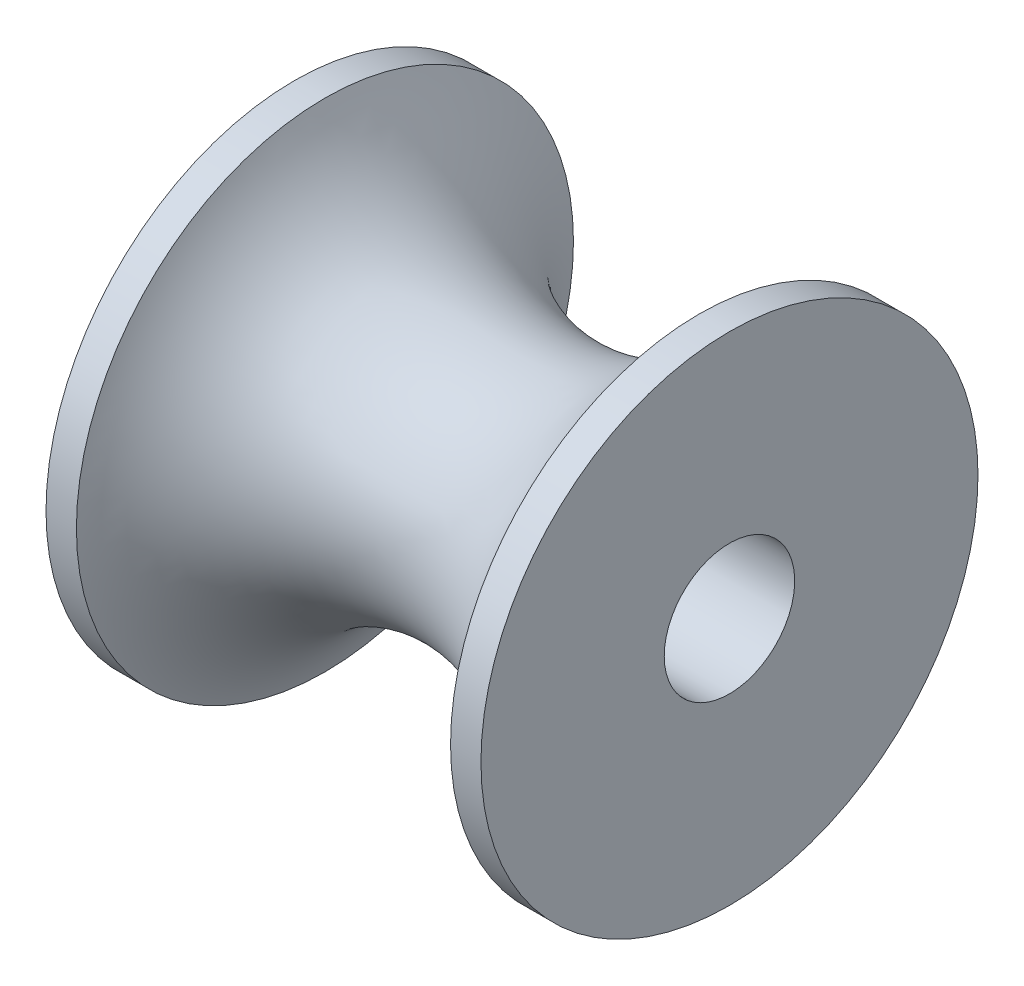
ISO-10303-21;
HEADER;
FILE_DESCRIPTION(('STEP AP214'),'2;1');
FILE_NAME('part.step','',(''),(''),'','','');
FILE_SCHEMA(('AUTOMOTIVE_DESIGN { 1 0 10303 214 1 1 1 1 }'));
ENDSEC;
DATA;
#1=APPLICATION_CONTEXT('core data for automotive mechanical design processes');
#2=APPLICATION_PROTOCOL_DEFINITION('international standard','automotive_design',2000,#1);
#3=PRODUCT_CONTEXT('',#1,'mechanical');
#4=PRODUCT('Part','Part','',(#3));
#5=PRODUCT_RELATED_PRODUCT_CATEGORY('part','',(#4));
#6=PRODUCT_DEFINITION_FORMATION('','',#4);
#7=PRODUCT_DEFINITION_CONTEXT('part definition',#1,'design');
#8=PRODUCT_DEFINITION('design','',#6,#7);
#9=PRODUCT_DEFINITION_SHAPE('','',#8);
#10=(LENGTH_UNIT() NAMED_UNIT(*) SI_UNIT(.MILLI.,.METRE.));
#11=(NAMED_UNIT(*) PLANE_ANGLE_UNIT() SI_UNIT($,.RADIAN.));
#12=(NAMED_UNIT(*) SI_UNIT($,.STERADIAN.) SOLID_ANGLE_UNIT());
#13=UNCERTAINTY_MEASURE_WITH_UNIT(LENGTH_MEASURE(1.E-05),#10,'distance_accuracy_value','');
#14=(GEOMETRIC_REPRESENTATION_CONTEXT(3) GLOBAL_UNCERTAINTY_ASSIGNED_CONTEXT((#13)) GLOBAL_UNIT_ASSIGNED_CONTEXT((#10,
#11,#12)) REPRESENTATION_CONTEXT('',''));
#15=CARTESIAN_POINT('',(0.,0.,0.));
#16=DIRECTION('',(0.,0.,1.));
#17=DIRECTION('',(1.,0.,0.));
#18=AXIS2_PLACEMENT_3D('',#15,#16,#17);
#19=CARTESIAN_POINT('',(0.,0.,0.));
#20=DIRECTION('',(1.,0.,0.));
#21=DIRECTION('',(0.,0.,-1.));
#22=AXIS2_PLACEMENT_3D('',#19,#20,#21);
#23=PLANE('',#22);
#24=CARTESIAN_POINT('',(0.,0.,0.));
#25=DIRECTION('',(-1.,0.,0.));
#26=DIRECTION('',(0.,0.,1.));
#27=AXIS2_PLACEMENT_3D('',#24,#25,#26);
#28=CIRCLE('',#27,2.1);
#29=CARTESIAN_POINT('',(0.,0.,2.1));
#30=VERTEX_POINT('',#29);
#31=EDGE_CURVE('E75',#30,#30,#28,.T.);
#32=ORIENTED_EDGE('',*,*,#31,.F.);
#33=EDGE_LOOP('',(#32));
#34=FACE_BOUND('',#33,.T.);
#35=CARTESIAN_POINT('',(0.,0.,0.));
#36=DIRECTION('',(-1.,0.,0.));
#37=DIRECTION('',(0.,0.,1.));
#38=AXIS2_PLACEMENT_3D('',#35,#36,#37);
#39=CIRCLE('',#38,8.);
#40=CARTESIAN_POINT('',(0.,0.,8.));
#41=VERTEX_POINT('',#40);
#42=EDGE_CURVE('E68',#41,#41,#39,.T.);
#43=ORIENTED_EDGE('',*,*,#42,.T.);
#44=EDGE_LOOP('',(#43));
#45=FACE_BOUND('',#44,.T.);
#46=ADVANCED_FACE('F51',(#34,#45),#23,.F.);
#47=CARTESIAN_POINT('',(14.,0.,0.));
#48=DIRECTION('',(-1.,0.,0.));
#49=DIRECTION('',(0.,0.,1.));
#50=AXIS2_PLACEMENT_3D('',#47,#48,#49);
#51=PLANE('',#50);
#52=CARTESIAN_POINT('',(14.,0.,0.));
#53=DIRECTION('',(-1.,0.,0.));
#54=DIRECTION('',(0.,0.,1.));
#55=AXIS2_PLACEMENT_3D('',#52,#53,#54);
#56=CIRCLE('',#55,2.1);
#57=CARTESIAN_POINT('',(14.,0.,2.1));
#58=VERTEX_POINT('',#57);
#59=EDGE_CURVE('E74',#58,#58,#56,.T.);
#60=ORIENTED_EDGE('',*,*,#59,.T.);
#61=EDGE_LOOP('',(#60));
#62=FACE_BOUND('',#61,.T.);
#63=CARTESIAN_POINT('',(14.,0.,0.));
#64=DIRECTION('',(-1.,0.,0.));
#65=DIRECTION('',(0.,0.,1.));
#66=AXIS2_PLACEMENT_3D('',#63,#64,#65);
#67=CIRCLE('',#66,8.);
#68=CARTESIAN_POINT('',(14.,0.,8.));
#69=VERTEX_POINT('',#68);
#70=EDGE_CURVE('E11',#69,#69,#67,.T.);
#71=ORIENTED_EDGE('',*,*,#70,.F.);
#72=EDGE_LOOP('',(#71));
#73=FACE_BOUND('',#72,.T.);
#74=ADVANCED_FACE('F83',(#62,#73),#51,.F.);
#75=CARTESIAN_POINT('',(0.,0.,0.));
#76=DIRECTION('',(-1.,0.,0.));
#77=DIRECTION('',(0.,0.,1.));
#78=AXIS2_PLACEMENT_3D('',#75,#76,#77);
#79=CYLINDRICAL_SURFACE('',#78,8.);
#80=CARTESIAN_POINT('',(13.0214330518296,0.,0.));
#81=DIRECTION('',(-1.,0.,0.));
#82=DIRECTION('',(0.,0.,1.));
#83=AXIS2_PLACEMENT_3D('',#80,#81,#82);
#84=CIRCLE('',#83,8.);
#85=CARTESIAN_POINT('',(13.0214330518296,0.,8.));
#86=VERTEX_POINT('',#85);
#87=EDGE_CURVE('E58',#86,#86,#84,.T.);
#88=ORIENTED_EDGE('',*,*,#87,.F.);
#89=EDGE_LOOP('',(#88));
#90=FACE_BOUND('',#89,.T.);
#91=ORIENTED_EDGE('',*,*,#70,.T.);
#92=EDGE_LOOP('',(#91));
#93=FACE_BOUND('',#92,.T.);
#94=ADVANCED_FACE('F104',(#90,#93),#79,.T.);
#95=CARTESIAN_POINT('',(7.,0.,0.));
#96=DIRECTION('',(-1.,0.,0.));
#97=DIRECTION('',(0.,0.,1.));
#98=AXIS2_PLACEMENT_3D('',#95,#96,#97);
#99=TOROIDAL_SURFACE('',#98,10.4479264699608,6.5);
#100=CARTESIAN_POINT('',(0.978566948170445,0.,0.));
#101=DIRECTION('',(-1.,0.,0.));
#102=DIRECTION('',(0.,0.,1.));
#103=AXIS2_PLACEMENT_3D('',#100,#101,#102);
#104=CIRCLE('',#103,8.);
#105=CARTESIAN_POINT('',(0.978566948170445,0.,8.));
#106=VERTEX_POINT('',#105);
#107=EDGE_CURVE('E63',#106,#106,#104,.T.);
#108=ORIENTED_EDGE('',*,*,#107,.F.);
#109=EDGE_LOOP('',(#108));
#110=FACE_BOUND('',#109,.T.);
#111=ORIENTED_EDGE('',*,*,#87,.T.);
#112=EDGE_LOOP('',(#111));
#113=FACE_BOUND('',#112,.T.);
#114=ADVANCED_FACE('F99',(#110,#113),#99,.F.);
#115=CARTESIAN_POINT('',(0.,0.,0.));
#116=DIRECTION('',(-1.,0.,0.));
#117=DIRECTION('',(0.,0.,1.));
#118=AXIS2_PLACEMENT_3D('',#115,#116,#117);
#119=CYLINDRICAL_SURFACE('',#118,8.);
#120=ORIENTED_EDGE('',*,*,#42,.F.);
#121=EDGE_LOOP('',(#120));
#122=FACE_BOUND('',#121,.T.);
#123=ORIENTED_EDGE('',*,*,#107,.T.);
#124=EDGE_LOOP('',(#123));
#125=FACE_BOUND('',#124,.T.);
#126=ADVANCED_FACE('F89',(#122,#125),#119,.T.);
#127=CARTESIAN_POINT('',(14.,0.,0.));
#128=DIRECTION('',(-1.,0.,0.));
#129=DIRECTION('',(0.,0.,1.));
#130=AXIS2_PLACEMENT_3D('',#127,#128,#129);
#131=CYLINDRICAL_SURFACE('',#130,2.1);
#132=ORIENTED_EDGE('',*,*,#59,.F.);
#133=EDGE_LOOP('',(#132));
#134=FACE_BOUND('',#133,.T.);
#135=ORIENTED_EDGE('',*,*,#31,.T.);
#136=EDGE_LOOP('',(#135));
#137=FACE_BOUND('',#136,.T.);
#138=ADVANCED_FACE('F86',(#134,#137),#131,.F.);
#139=CLOSED_SHELL('',(#46,#74,#94,#114,#126,#138));
#140=MANIFOLD_SOLID_BREP('B2',#139);
#141=ADVANCED_BREP_SHAPE_REPRESENTATION('',(#18,#140),#14);
#142=SHAPE_DEFINITION_REPRESENTATION(#9,#141);
ENDSEC;
END-ISO-10303-21;
